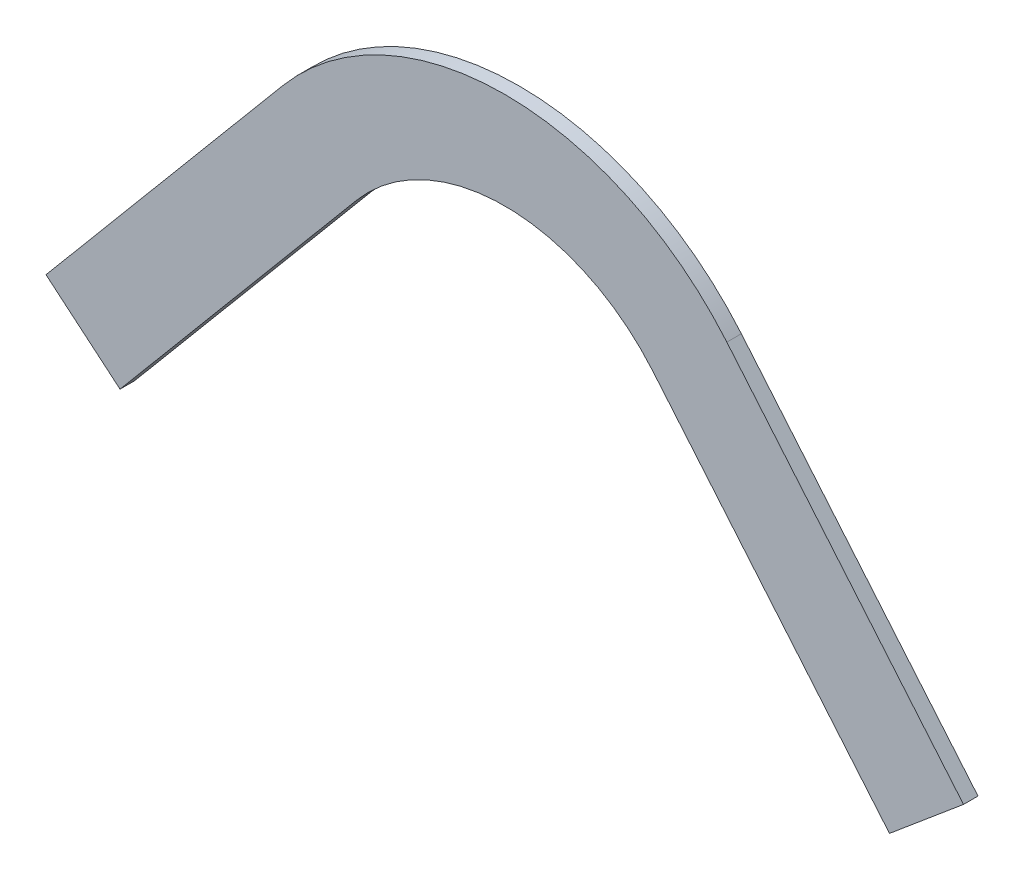
ISO-10303-21;
HEADER;
FILE_DESCRIPTION(('STEP AP214'),'2;1');
FILE_NAME('part.step','',(''),(''),'','','');
FILE_SCHEMA(('AUTOMOTIVE_DESIGN { 1 0 10303 214 1 1 1 1 }'));
ENDSEC;
DATA;
#1=APPLICATION_CONTEXT('core data for automotive mechanical design processes');
#2=APPLICATION_PROTOCOL_DEFINITION('international standard','automotive_design',2000,#1);
#3=PRODUCT_CONTEXT('',#1,'mechanical');
#4=PRODUCT('Part','Part','',(#3));
#5=PRODUCT_RELATED_PRODUCT_CATEGORY('part','',(#4));
#6=PRODUCT_DEFINITION_FORMATION('','',#4);
#7=PRODUCT_DEFINITION_CONTEXT('part definition',#1,'design');
#8=PRODUCT_DEFINITION('design','',#6,#7);
#9=PRODUCT_DEFINITION_SHAPE('','',#8);
#10=(LENGTH_UNIT() NAMED_UNIT(*) SI_UNIT(.MILLI.,.METRE.));
#11=(NAMED_UNIT(*) PLANE_ANGLE_UNIT() SI_UNIT($,.RADIAN.));
#12=(NAMED_UNIT(*) SI_UNIT($,.STERADIAN.) SOLID_ANGLE_UNIT());
#13=UNCERTAINTY_MEASURE_WITH_UNIT(LENGTH_MEASURE(1.E-05),#10,'distance_accuracy_value','');
#14=(GEOMETRIC_REPRESENTATION_CONTEXT(3) GLOBAL_UNCERTAINTY_ASSIGNED_CONTEXT((#13)) GLOBAL_UNIT_ASSIGNED_CONTEXT((#10,
#11,#12)) REPRESENTATION_CONTEXT('',''));
#15=CARTESIAN_POINT('',(0.,0.,0.));
#16=DIRECTION('',(0.,0.,1.));
#17=DIRECTION('',(1.,0.,0.));
#18=AXIS2_PLACEMENT_3D('',#15,#16,#17);
#19=CARTESIAN_POINT('',(0.,0.,1.5));
#20=DIRECTION('',(0.,0.,-1.));
#21=DIRECTION('',(-1.,0.,0.));
#22=AXIS2_PLACEMENT_3D('',#19,#20,#21);
#23=CYLINDRICAL_SURFACE('',#22,60.);
#24=CARTESIAN_POINT('',(0.,0.,-1.5));
#25=DIRECTION('',(0.,0.,1.));
#26=DIRECTION('',(1.,0.,0.));
#27=AXIS2_PLACEMENT_3D('',#24,#25,#26);
#28=CIRCLE('',#27,60.);
#29=CARTESIAN_POINT('',(45.9626665871388,38.5672565811923,-1.5));
#30=VERTEX_POINT('',#29);
#31=CARTESIAN_POINT('',(-45.9626665871388,38.5672565811923,-1.5));
#32=VERTEX_POINT('',#31);
#33=EDGE_CURVE('E59',#30,#32,#28,.T.);
#34=ORIENTED_EDGE('',*,*,#33,.T.);
#35=DIRECTION('',(0.,0.,-1.));
#36=VECTOR('',#35,1.);
#37=CARTESIAN_POINT('',(-45.9626665871388,38.5672565811923,1.5));
#38=LINE('',#37,#36);
#39=CARTESIAN_POINT('',(-45.9626665871388,38.5672565811923,1.5));
#40=VERTEX_POINT('',#39);
#41=EDGE_CURVE('E11',#40,#32,#38,.T.);
#42=ORIENTED_EDGE('',*,*,#41,.F.);
#43=CARTESIAN_POINT('',(0.,0.,1.5));
#44=DIRECTION('',(0.,0.,1.));
#45=DIRECTION('',(1.,0.,0.));
#46=AXIS2_PLACEMENT_3D('',#43,#44,#45);
#47=CIRCLE('',#46,60.);
#48=CARTESIAN_POINT('',(45.9626665871388,38.5672565811923,1.5));
#49=VERTEX_POINT('',#48);
#50=EDGE_CURVE('E49',#49,#40,#47,.T.);
#51=ORIENTED_EDGE('',*,*,#50,.F.);
#52=DIRECTION('',(0.,0.,-1.));
#53=VECTOR('',#52,1.);
#54=CARTESIAN_POINT('',(45.9626665871388,38.5672565811923,1.5));
#55=LINE('',#54,#53);
#56=EDGE_CURVE('E87',#49,#30,#55,.T.);
#57=ORIENTED_EDGE('',*,*,#56,.T.);
#58=EDGE_LOOP('',(#34,#42,#51,#57));
#59=FACE_BOUND('',#58,.T.);
#60=ADVANCED_FACE('F33',(#59),#23,.T.);
#61=CARTESIAN_POINT('',(0.,0.,1.5));
#62=DIRECTION('',(0.,0.,-1.));
#63=DIRECTION('',(-1.,0.,0.));
#64=AXIS2_PLACEMENT_3D('',#61,#62,#63);
#65=CYLINDRICAL_SURFACE('',#64,40.);
#66=CARTESIAN_POINT('',(0.,0.,-1.5));
#67=DIRECTION('',(0.,0.,-1.));
#68=DIRECTION('',(1.,0.,0.));
#69=AXIS2_PLACEMENT_3D('',#66,#67,#68);
#70=CIRCLE('',#69,40.);
#71=CARTESIAN_POINT('',(-30.6417777247592,25.7115043874615,-1.5));
#72=VERTEX_POINT('',#71);
#73=CARTESIAN_POINT('',(30.6417777247592,25.7115043874615,-1.5));
#74=VERTEX_POINT('',#73);
#75=EDGE_CURVE('E68',#72,#74,#70,.T.);
#76=ORIENTED_EDGE('',*,*,#75,.T.);
#77=DIRECTION('',(0.,0.,-1.));
#78=VECTOR('',#77,1.);
#79=CARTESIAN_POINT('',(30.6417777247592,25.7115043874615,1.5));
#80=LINE('',#79,#78);
#81=CARTESIAN_POINT('',(30.6417777247592,25.7115043874615,1.5));
#82=VERTEX_POINT('',#81);
#83=EDGE_CURVE('E82',#82,#74,#80,.T.);
#84=ORIENTED_EDGE('',*,*,#83,.F.);
#85=CARTESIAN_POINT('',(0.,0.,1.5));
#86=DIRECTION('',(0.,0.,-1.));
#87=DIRECTION('',(1.,0.,0.));
#88=AXIS2_PLACEMENT_3D('',#85,#86,#87);
#89=CIRCLE('',#88,40.);
#90=CARTESIAN_POINT('',(-30.6417777247592,25.7115043874615,1.5));
#91=VERTEX_POINT('',#90);
#92=EDGE_CURVE('E77',#91,#82,#89,.T.);
#93=ORIENTED_EDGE('',*,*,#92,.F.);
#94=DIRECTION('',(0.,0.,-1.));
#95=VECTOR('',#94,1.);
#96=CARTESIAN_POINT('',(-30.6417777247592,25.7115043874615,1.5));
#97=LINE('',#96,#95);
#98=EDGE_CURVE('E41',#91,#72,#97,.T.);
#99=ORIENTED_EDGE('',*,*,#98,.T.);
#100=EDGE_LOOP('',(#76,#84,#93,#99));
#101=FACE_BOUND('',#100,.T.);
#102=ADVANCED_FACE('F79',(#101),#65,.F.);
#103=CARTESIAN_POINT('',(0.,0.,1.5));
#104=DIRECTION('',(0.,0.,1.));
#105=DIRECTION('',(1.,0.,0.));
#106=AXIS2_PLACEMENT_3D('',#103,#104,#105);
#107=PLANE('',#106);
#108=ORIENTED_EDGE('',*,*,#50,.T.);
#109=DIRECTION('',(0.642787609686538,0.766044443118979,0.));
#110=VECTOR('',#109,1.);
#111=CARTESIAN_POINT('',(-62.8037019609261,18.496892171475,1.5));
#112=LINE('',#111,#110);
#113=CARTESIAN_POINT('',(-94.9430824452529,-19.805329984474,1.5));
#114=VERTEX_POINT('',#113);
#115=EDGE_CURVE('E112',#114,#40,#112,.T.);
#116=ORIENTED_EDGE('',*,*,#115,.F.);
#117=DIRECTION('',(-0.766044443118979,0.642787609686538,0.));
#118=VECTOR('',#117,1.);
#119=CARTESIAN_POINT('',(-79.6221935828733,-32.6610821782047,1.5));
#120=LINE('',#119,#118);
#121=CARTESIAN_POINT('',(-79.6221935828733,-32.6610821782047,1.5));
#122=VERTEX_POINT('',#121);
#123=EDGE_CURVE('E100',#122,#114,#120,.T.);
#124=ORIENTED_EDGE('',*,*,#123,.F.);
#125=DIRECTION('',(0.642787609686538,0.766044443118979,0.));
#126=VECTOR('',#125,1.);
#127=CARTESIAN_POINT('',(-47.4828130985465,5.64113997774424,1.5));
#128=LINE('',#127,#126);
#129=EDGE_CURVE('E94',#122,#91,#128,.T.);
#130=ORIENTED_EDGE('',*,*,#129,.T.);
#131=ORIENTED_EDGE('',*,*,#92,.T.);
#132=DIRECTION('',(-0.642787609686538,0.766044443118979,0.));
#133=VECTOR('',#132,1.);
#134=CARTESIAN_POINT('',(47.4828130985465,5.64113997774424,1.5));
#135=LINE('',#134,#133);
#136=CARTESIAN_POINT('',(79.6221935828733,-32.6610821782048,1.5));
#137=VERTEX_POINT('',#136);
#138=EDGE_CURVE('E102',#137,#82,#135,.T.);
#139=ORIENTED_EDGE('',*,*,#138,.F.);
#140=DIRECTION('',(-0.766044443118979,-0.642787609686538,0.));
#141=VECTOR('',#140,1.);
#142=CARTESIAN_POINT('',(79.6221935828733,-32.6610821782048,1.5));
#143=LINE('',#142,#141);
#144=CARTESIAN_POINT('',(94.9430824452529,-19.805329984474,1.5));
#145=VERTEX_POINT('',#144);
#146=EDGE_CURVE('E130',#145,#137,#143,.T.);
#147=ORIENTED_EDGE('',*,*,#146,.F.);
#148=DIRECTION('',(-0.642787609686538,0.766044443118979,0.));
#149=VECTOR('',#148,1.);
#150=CARTESIAN_POINT('',(62.803701960926,18.496892171475,1.5));
#151=LINE('',#150,#149);
#152=EDGE_CURVE('E150',#145,#49,#151,.T.);
#153=ORIENTED_EDGE('',*,*,#152,.T.);
#154=EDGE_LOOP('',(#108,#116,#124,#130,#131,#139,#147,#153));
#155=FACE_BOUND('',#154,.T.);
#156=ADVANCED_FACE('F97',(#155),#107,.T.);
#157=CARTESIAN_POINT('',(0.,0.,-1.5));
#158=DIRECTION('',(0.,0.,1.));
#159=DIRECTION('',(1.,0.,0.));
#160=AXIS2_PLACEMENT_3D('',#157,#158,#159);
#161=PLANE('',#160);
#162=ORIENTED_EDGE('',*,*,#33,.F.);
#163=DIRECTION('',(-0.642787609686538,0.766044443118979,0.));
#164=VECTOR('',#163,1.);
#165=CARTESIAN_POINT('',(62.803701960926,18.496892171475,-1.5));
#166=LINE('',#165,#164);
#167=CARTESIAN_POINT('',(94.9430824452529,-19.805329984474,-1.5));
#168=VERTEX_POINT('',#167);
#169=EDGE_CURVE('E164',#168,#30,#166,.T.);
#170=ORIENTED_EDGE('',*,*,#169,.F.);
#171=DIRECTION('',(-0.766044443118979,-0.642787609686538,0.));
#172=VECTOR('',#171,1.);
#173=CARTESIAN_POINT('',(79.6221935828733,-32.6610821782048,-1.5));
#174=LINE('',#173,#172);
#175=CARTESIAN_POINT('',(79.6221935828733,-32.6610821782048,-1.5));
#176=VERTEX_POINT('',#175);
#177=EDGE_CURVE('E169',#168,#176,#174,.T.);
#178=ORIENTED_EDGE('',*,*,#177,.T.);
#179=DIRECTION('',(-0.642787609686538,0.766044443118979,0.));
#180=VECTOR('',#179,1.);
#181=CARTESIAN_POINT('',(47.4828130985465,5.64113997774424,-1.5));
#182=LINE('',#181,#180);
#183=EDGE_CURVE('E106',#176,#74,#182,.T.);
#184=ORIENTED_EDGE('',*,*,#183,.T.);
#185=ORIENTED_EDGE('',*,*,#75,.F.);
#186=DIRECTION('',(0.642787609686538,0.766044443118979,0.));
#187=VECTOR('',#186,1.);
#188=CARTESIAN_POINT('',(-47.4828130985465,5.64113997774424,-1.5));
#189=LINE('',#188,#187);
#190=CARTESIAN_POINT('',(-79.6221935828733,-32.6610821782047,-1.5));
#191=VERTEX_POINT('',#190);
#192=EDGE_CURVE('E96',#191,#72,#189,.T.);
#193=ORIENTED_EDGE('',*,*,#192,.F.);
#194=DIRECTION('',(-0.766044443118979,0.642787609686538,0.));
#195=VECTOR('',#194,1.);
#196=CARTESIAN_POINT('',(-79.6221935828733,-32.6610821782047,-1.5));
#197=LINE('',#196,#195);
#198=CARTESIAN_POINT('',(-94.9430824452529,-19.805329984474,-1.5));
#199=VERTEX_POINT('',#198);
#200=EDGE_CURVE('E147',#191,#199,#197,.T.);
#201=ORIENTED_EDGE('',*,*,#200,.T.);
#202=DIRECTION('',(0.642787609686538,0.766044443118979,0.));
#203=VECTOR('',#202,1.);
#204=CARTESIAN_POINT('',(-62.8037019609261,18.496892171475,-1.5));
#205=LINE('',#204,#203);
#206=EDGE_CURVE('E104',#199,#32,#205,.T.);
#207=ORIENTED_EDGE('',*,*,#206,.T.);
#208=EDGE_LOOP('',(#162,#170,#178,#184,#185,#193,#201,#207));
#209=FACE_BOUND('',#208,.T.);
#210=ADVANCED_FACE('F145',(#209),#161,.F.);
#211=CARTESIAN_POINT('',(-62.8037019609261,18.496892171475,1.5));
#212=DIRECTION('',(0.766044443118979,-0.642787609686538,0.));
#213=DIRECTION('',(0.642787609686538,0.766044443118979,0.));
#214=AXIS2_PLACEMENT_3D('',#211,#212,#213);
#215=PLANE('',#214);
#216=ORIENTED_EDGE('',*,*,#41,.T.);
#217=ORIENTED_EDGE('',*,*,#206,.F.);
#218=DIRECTION('',(0.,0.,-1.));
#219=VECTOR('',#218,1.);
#220=CARTESIAN_POINT('',(-94.9430824452529,-19.805329984474,71.2826304034494));
#221=LINE('',#220,#219);
#222=EDGE_CURVE('E151',#114,#199,#221,.T.);
#223=ORIENTED_EDGE('',*,*,#222,.F.);
#224=ORIENTED_EDGE('',*,*,#115,.T.);
#225=EDGE_LOOP('',(#216,#217,#223,#224));
#226=FACE_BOUND('',#225,.T.);
#227=ADVANCED_FACE('F179',(#226),#215,.F.);
#228=CARTESIAN_POINT('',(-47.4828130985465,5.64113997774424,1.5));
#229=DIRECTION('',(-0.766044443118979,0.642787609686538,0.));
#230=DIRECTION('',(-0.642787609686538,-0.766044443118979,0.));
#231=AXIS2_PLACEMENT_3D('',#228,#229,#230);
#232=PLANE('',#231);
#233=ORIENTED_EDGE('',*,*,#98,.F.);
#234=ORIENTED_EDGE('',*,*,#129,.F.);
#235=DIRECTION('',(0.,0.,-1.));
#236=VECTOR('',#235,1.);
#237=CARTESIAN_POINT('',(-79.6221935828733,-32.6610821782047,71.2826304034494));
#238=LINE('',#237,#236);
#239=EDGE_CURVE('E148',#122,#191,#238,.T.);
#240=ORIENTED_EDGE('',*,*,#239,.T.);
#241=ORIENTED_EDGE('',*,*,#192,.T.);
#242=EDGE_LOOP('',(#233,#234,#240,#241));
#243=FACE_BOUND('',#242,.T.);
#244=ADVANCED_FACE('F91',(#243),#232,.F.);
#245=CARTESIAN_POINT('',(47.4828130985465,5.64113997774424,1.5));
#246=DIRECTION('',(-0.766044443118979,-0.642787609686538,0.));
#247=DIRECTION('',(0.642787609686538,-0.766044443118979,0.));
#248=AXIS2_PLACEMENT_3D('',#245,#246,#247);
#249=PLANE('',#248);
#250=ORIENTED_EDGE('',*,*,#83,.T.);
#251=ORIENTED_EDGE('',*,*,#183,.F.);
#252=DIRECTION('',(0.,0.,-1.));
#253=VECTOR('',#252,1.);
#254=CARTESIAN_POINT('',(79.6221935828733,-32.6610821782048,71.2826304034494));
#255=LINE('',#254,#253);
#256=EDGE_CURVE('E126',#137,#176,#255,.T.);
#257=ORIENTED_EDGE('',*,*,#256,.F.);
#258=ORIENTED_EDGE('',*,*,#138,.T.);
#259=EDGE_LOOP('',(#250,#251,#257,#258));
#260=FACE_BOUND('',#259,.T.);
#261=ADVANCED_FACE('F121',(#260),#249,.T.);
#262=CARTESIAN_POINT('',(62.803701960926,18.496892171475,1.5));
#263=DIRECTION('',(0.766044443118979,0.642787609686538,0.));
#264=DIRECTION('',(-0.642787609686538,0.766044443118979,0.));
#265=AXIS2_PLACEMENT_3D('',#262,#263,#264);
#266=PLANE('',#265);
#267=ORIENTED_EDGE('',*,*,#56,.F.);
#268=ORIENTED_EDGE('',*,*,#152,.F.);
#269=DIRECTION('',(0.,0.,-1.));
#270=VECTOR('',#269,1.);
#271=CARTESIAN_POINT('',(94.9430824452529,-19.805329984474,71.2826304034494));
#272=LINE('',#271,#270);
#273=EDGE_CURVE('E160',#145,#168,#272,.T.);
#274=ORIENTED_EDGE('',*,*,#273,.T.);
#275=ORIENTED_EDGE('',*,*,#169,.T.);
#276=EDGE_LOOP('',(#267,#268,#274,#275));
#277=FACE_BOUND('',#276,.T.);
#278=ADVANCED_FACE('F177',(#277),#266,.T.);
#279=CARTESIAN_POINT('',(-79.6221935828733,-32.6610821782047,71.2826304034494));
#280=DIRECTION('',(-0.642787609686538,-0.766044443118979,0.));
#281=DIRECTION('',(0.766044443118979,-0.642787609686538,0.));
#282=AXIS2_PLACEMENT_3D('',#279,#280,#281);
#283=PLANE('',#282);
#284=ORIENTED_EDGE('',*,*,#239,.F.);
#285=ORIENTED_EDGE('',*,*,#123,.T.);
#286=ORIENTED_EDGE('',*,*,#222,.T.);
#287=ORIENTED_EDGE('',*,*,#200,.F.);
#288=EDGE_LOOP('',(#284,#285,#286,#287));
#289=FACE_BOUND('',#288,.T.);
#290=ADVANCED_FACE('F154',(#289),#283,.T.);
#291=CARTESIAN_POINT('',(79.6221935828733,-32.6610821782048,71.2826304034494));
#292=DIRECTION('',(0.642787609686538,-0.766044443118979,0.));
#293=DIRECTION('',(0.766044443118979,0.642787609686538,0.));
#294=AXIS2_PLACEMENT_3D('',#291,#292,#293);
#295=PLANE('',#294);
#296=ORIENTED_EDGE('',*,*,#273,.F.);
#297=ORIENTED_EDGE('',*,*,#146,.T.);
#298=ORIENTED_EDGE('',*,*,#256,.T.);
#299=ORIENTED_EDGE('',*,*,#177,.F.);
#300=EDGE_LOOP('',(#296,#297,#298,#299));
#301=FACE_BOUND('',#300,.T.);
#302=ADVANCED_FACE('F174',(#301),#295,.T.);
#303=CLOSED_SHELL('',(#60,#102,#156,#210,#227,#244,#261,#278,#290,#302));
#304=MANIFOLD_SOLID_BREP('B2',#303);
#305=ADVANCED_BREP_SHAPE_REPRESENTATION('',(#18,#304),#14);
#306=SHAPE_DEFINITION_REPRESENTATION(#9,#305);
ENDSEC;
END-ISO-10303-21;
